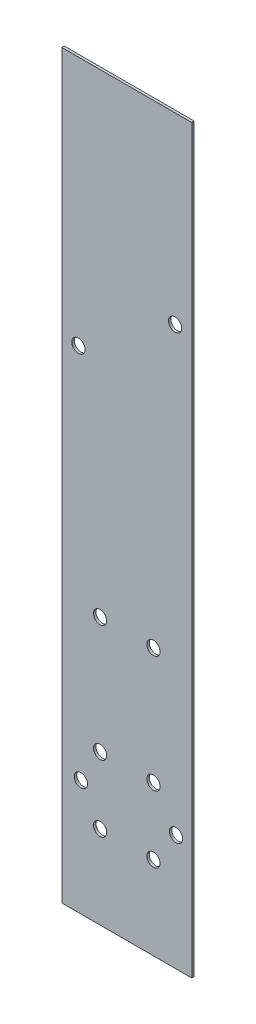
ISO-10303-21;
HEADER;
FILE_DESCRIPTION(('STEP AP214'),'2;1');
FILE_NAME('part.step','',(''),(''),'','','');
FILE_SCHEMA(('AUTOMOTIVE_DESIGN { 1 0 10303 214 1 1 1 1 }'));
ENDSEC;
DATA;
#1=APPLICATION_CONTEXT('core data for automotive mechanical design processes');
#2=APPLICATION_PROTOCOL_DEFINITION('international standard','automotive_design',2000,#1);
#3=PRODUCT_CONTEXT('',#1,'mechanical');
#4=PRODUCT('Part','Part','',(#3));
#5=PRODUCT_RELATED_PRODUCT_CATEGORY('part','',(#4));
#6=PRODUCT_DEFINITION_FORMATION('','',#4);
#7=PRODUCT_DEFINITION_CONTEXT('part definition',#1,'design');
#8=PRODUCT_DEFINITION('design','',#6,#7);
#9=PRODUCT_DEFINITION_SHAPE('','',#8);
#10=(LENGTH_UNIT() NAMED_UNIT(*) SI_UNIT(.MILLI.,.METRE.));
#11=(NAMED_UNIT(*) PLANE_ANGLE_UNIT() SI_UNIT($,.RADIAN.));
#12=(NAMED_UNIT(*) SI_UNIT($,.STERADIAN.) SOLID_ANGLE_UNIT());
#13=UNCERTAINTY_MEASURE_WITH_UNIT(LENGTH_MEASURE(1.E-05),#10,'distance_accuracy_value','');
#14=(GEOMETRIC_REPRESENTATION_CONTEXT(3) GLOBAL_UNCERTAINTY_ASSIGNED_CONTEXT((#13)) GLOBAL_UNIT_ASSIGNED_CONTEXT((#10,
#11,#12)) REPRESENTATION_CONTEXT('',''));
#15=CARTESIAN_POINT('',(0.,0.,0.));
#16=DIRECTION('',(0.,0.,1.));
#17=DIRECTION('',(1.,0.,0.));
#18=AXIS2_PLACEMENT_3D('',#15,#16,#17);
#19=CARTESIAN_POINT('',(0.,222.25,-0.736600000000004));
#20=DIRECTION('',(-1.,0.,0.));
#21=DIRECTION('',(0.,-1.,0.));
#22=AXIS2_PLACEMENT_3D('',#19,#20,#21);
#23=PLANE('',#22);
#24=DIRECTION('',(0.,-1.,0.));
#25=VECTOR('',#24,1.);
#26=CARTESIAN_POINT('',(0.,222.25,0.));
#27=LINE('',#26,#25);
#28=CARTESIAN_POINT('',(0.,222.25,0.));
#29=VERTEX_POINT('',#28);
#30=CARTESIAN_POINT('',(0.,0.,0.));
#31=VERTEX_POINT('',#30);
#32=EDGE_CURVE('E105',#29,#31,#27,.T.);
#33=ORIENTED_EDGE('',*,*,#32,.F.);
#34=DIRECTION('',(0.,0.,1.));
#35=VECTOR('',#34,1.);
#36=CARTESIAN_POINT('',(0.,222.25,-0.736600000000004));
#37=LINE('',#36,#35);
#38=CARTESIAN_POINT('',(0.,222.25,-0.736600000000004));
#39=VERTEX_POINT('',#38);
#40=EDGE_CURVE('E11',#39,#29,#37,.T.);
#41=ORIENTED_EDGE('',*,*,#40,.F.);
#42=DIRECTION('',(0.,-1.,0.));
#43=VECTOR('',#42,1.);
#44=CARTESIAN_POINT('',(0.,222.25,-0.736600000000004));
#45=LINE('',#44,#43);
#46=CARTESIAN_POINT('',(0.,0.,-0.736600000000004));
#47=VERTEX_POINT('',#46);
#48=EDGE_CURVE('E98',#39,#47,#45,.T.);
#49=ORIENTED_EDGE('',*,*,#48,.T.);
#50=DIRECTION('',(0.,0.,1.));
#51=VECTOR('',#50,1.);
#52=CARTESIAN_POINT('',(0.,0.,-0.736600000000004));
#53=LINE('',#52,#51);
#54=EDGE_CURVE('E43',#47,#31,#53,.T.);
#55=ORIENTED_EDGE('',*,*,#54,.T.);
#56=EDGE_LOOP('',(#33,#41,#49,#55));
#57=FACE_BOUND('',#56,.T.);
#58=ADVANCED_FACE('F40',(#57),#23,.T.);
#59=CARTESIAN_POINT('',(0.,222.25,-0.736600000000004));
#60=DIRECTION('',(0.,1.,0.));
#61=DIRECTION('',(0.,0.,1.));
#62=AXIS2_PLACEMENT_3D('',#59,#60,#61);
#63=PLANE('',#62);
#64=DIRECTION('',(-1.,0.,0.));
#65=VECTOR('',#64,1.);
#66=CARTESIAN_POINT('',(0.,222.25,0.));
#67=LINE('',#66,#65);
#68=CARTESIAN_POINT('',(39.,222.25,0.));
#69=VERTEX_POINT('',#68);
#70=EDGE_CURVE('E100',#69,#29,#67,.T.);
#71=ORIENTED_EDGE('',*,*,#70,.F.);
#72=DIRECTION('',(0.,0.,1.));
#73=VECTOR('',#72,1.);
#74=CARTESIAN_POINT('',(39.,222.25,-0.736600000000004));
#75=LINE('',#74,#73);
#76=CARTESIAN_POINT('',(39.,222.25,-0.736600000000004));
#77=VERTEX_POINT('',#76);
#78=EDGE_CURVE('E49',#77,#69,#75,.T.);
#79=ORIENTED_EDGE('',*,*,#78,.F.);
#80=DIRECTION('',(-1.,0.,0.));
#81=VECTOR('',#80,1.);
#82=CARTESIAN_POINT('',(0.,222.25,-0.736600000000004));
#83=LINE('',#82,#81);
#84=EDGE_CURVE('E95',#77,#39,#83,.T.);
#85=ORIENTED_EDGE('',*,*,#84,.T.);
#86=ORIENTED_EDGE('',*,*,#40,.T.);
#87=EDGE_LOOP('',(#71,#79,#85,#86));
#88=FACE_BOUND('',#87,.T.);
#89=ADVANCED_FACE('F116',(#88),#63,.T.);
#90=CARTESIAN_POINT('',(39.,222.25,-0.736600000000004));
#91=DIRECTION('',(1.,0.,0.));
#92=DIRECTION('',(0.,1.,0.));
#93=AXIS2_PLACEMENT_3D('',#90,#91,#92);
#94=PLANE('',#93);
#95=DIRECTION('',(0.,1.,0.));
#96=VECTOR('',#95,1.);
#97=CARTESIAN_POINT('',(39.,222.25,0.));
#98=LINE('',#97,#96);
#99=CARTESIAN_POINT('',(39.,0.,0.));
#100=VERTEX_POINT('',#99);
#101=EDGE_CURVE('E90',#100,#69,#98,.T.);
#102=ORIENTED_EDGE('',*,*,#101,.F.);
#103=DIRECTION('',(0.,0.,1.));
#104=VECTOR('',#103,1.);
#105=CARTESIAN_POINT('',(39.,0.,-0.736600000000004));
#106=LINE('',#105,#104);
#107=CARTESIAN_POINT('',(39.,0.,-0.736600000000004));
#108=VERTEX_POINT('',#107);
#109=EDGE_CURVE('E85',#108,#100,#106,.T.);
#110=ORIENTED_EDGE('',*,*,#109,.F.);
#111=DIRECTION('',(0.,1.,0.));
#112=VECTOR('',#111,1.);
#113=CARTESIAN_POINT('',(39.,222.25,-0.736600000000004));
#114=LINE('',#113,#112);
#115=EDGE_CURVE('E88',#108,#77,#114,.T.);
#116=ORIENTED_EDGE('',*,*,#115,.T.);
#117=ORIENTED_EDGE('',*,*,#78,.T.);
#118=EDGE_LOOP('',(#102,#110,#116,#117));
#119=FACE_BOUND('',#118,.T.);
#120=ADVANCED_FACE('F87',(#119),#94,.T.);
#121=CARTESIAN_POINT('',(0.,0.,-0.736600000000004));
#122=DIRECTION('',(0.,-1.,0.));
#123=DIRECTION('',(0.,0.,-1.));
#124=AXIS2_PLACEMENT_3D('',#121,#122,#123);
#125=PLANE('',#124);
#126=DIRECTION('',(1.,0.,0.));
#127=VECTOR('',#126,1.);
#128=CARTESIAN_POINT('',(0.,0.,0.));
#129=LINE('',#128,#127);
#130=EDGE_CURVE('E108',#31,#100,#129,.T.);
#131=ORIENTED_EDGE('',*,*,#130,.F.);
#132=ORIENTED_EDGE('',*,*,#54,.F.);
#133=DIRECTION('',(1.,0.,0.));
#134=VECTOR('',#133,1.);
#135=CARTESIAN_POINT('',(0.,0.,-0.736600000000004));
#136=LINE('',#135,#134);
#137=EDGE_CURVE('E94',#47,#108,#136,.T.);
#138=ORIENTED_EDGE('',*,*,#137,.T.);
#139=ORIENTED_EDGE('',*,*,#109,.T.);
#140=EDGE_LOOP('',(#131,#132,#138,#139));
#141=FACE_BOUND('',#140,.T.);
#142=ADVANCED_FACE('F97',(#141),#125,.T.);
#143=CARTESIAN_POINT('',(0.,0.,-0.736600000000004));
#144=DIRECTION('',(0.,0.,1.));
#145=DIRECTION('',(1.,0.,0.));
#146=AXIS2_PLACEMENT_3D('',#143,#144,#145);
#147=PLANE('',#146);
#148=CARTESIAN_POINT('',(11.5,25.,-0.736600000000004));
#149=DIRECTION('',(0.,0.,1.));
#150=DIRECTION('',(1.,0.,0.));
#151=AXIS2_PLACEMENT_3D('',#148,#149,#150);
#152=CIRCLE('',#151,1.98437500000002);
#153=CARTESIAN_POINT('',(13.484375,25.,-0.736600000000004));
#154=VERTEX_POINT('',#153);
#155=EDGE_CURVE('E184',#154,#154,#152,.T.);
#156=ORIENTED_EDGE('',*,*,#155,.T.);
#157=EDGE_LOOP('',(#156));
#158=FACE_BOUND('',#157,.T.);
#159=CARTESIAN_POINT('',(27.5,25.,-0.736600000000004));
#160=DIRECTION('',(0.,0.,1.));
#161=DIRECTION('',(1.,0.,0.));
#162=AXIS2_PLACEMENT_3D('',#159,#160,#161);
#163=CIRCLE('',#162,1.98437500000002);
#164=CARTESIAN_POINT('',(29.484375,25.,-0.736600000000004));
#165=VERTEX_POINT('',#164);
#166=EDGE_CURVE('E188',#165,#165,#163,.T.);
#167=ORIENTED_EDGE('',*,*,#166,.T.);
#168=EDGE_LOOP('',(#167));
#169=FACE_BOUND('',#168,.T.);
#170=CARTESIAN_POINT('',(34.2634,34.75,-0.736600000000004));
#171=DIRECTION('',(0.,0.,1.));
#172=DIRECTION('',(1.,0.,0.));
#173=AXIS2_PLACEMENT_3D('',#170,#171,#172);
#174=CIRCLE('',#173,1.98437500000002);
#175=CARTESIAN_POINT('',(36.247775,34.75,-0.736600000000004));
#176=VERTEX_POINT('',#175);
#177=EDGE_CURVE('E197',#176,#176,#174,.T.);
#178=ORIENTED_EDGE('',*,*,#177,.T.);
#179=EDGE_LOOP('',(#178));
#180=FACE_BOUND('',#179,.T.);
#181=CARTESIAN_POINT('',(5.73659999999999,34.75,-0.736600000000004));
#182=DIRECTION('',(0.,0.,1.));
#183=DIRECTION('',(1.,0.,0.));
#184=AXIS2_PLACEMENT_3D('',#181,#182,#183);
#185=CIRCLE('',#184,1.98437500000002);
#186=CARTESIAN_POINT('',(7.72097500000001,34.75,-0.736600000000004));
#187=VERTEX_POINT('',#186);
#188=EDGE_CURVE('E203',#187,#187,#185,.T.);
#189=ORIENTED_EDGE('',*,*,#188,.T.);
#190=EDGE_LOOP('',(#189));
#191=FACE_BOUND('',#190,.T.);
#192=CARTESIAN_POINT('',(27.5,45.,-0.736600000000004));
#193=DIRECTION('',(0.,0.,1.));
#194=DIRECTION('',(1.,0.,0.));
#195=AXIS2_PLACEMENT_3D('',#192,#193,#194);
#196=CIRCLE('',#195,1.98437500000002);
#197=CARTESIAN_POINT('',(29.484375,45.,-0.736600000000004));
#198=VERTEX_POINT('',#197);
#199=EDGE_CURVE('E209',#198,#198,#196,.T.);
#200=ORIENTED_EDGE('',*,*,#199,.T.);
#201=EDGE_LOOP('',(#200));
#202=FACE_BOUND('',#201,.T.);
#203=CARTESIAN_POINT('',(11.5,45.,-0.736600000000004));
#204=DIRECTION('',(0.,0.,1.));
#205=DIRECTION('',(1.,0.,0.));
#206=AXIS2_PLACEMENT_3D('',#203,#204,#205);
#207=CIRCLE('',#206,1.98437500000002);
#208=CARTESIAN_POINT('',(13.484375,45.,-0.736600000000004));
#209=VERTEX_POINT('',#208);
#210=EDGE_CURVE('E215',#209,#209,#207,.T.);
#211=ORIENTED_EDGE('',*,*,#210,.T.);
#212=EDGE_LOOP('',(#211));
#213=FACE_BOUND('',#212,.T.);
#214=CARTESIAN_POINT('',(11.5,80.0000000000001,-0.736600000000004));
#215=DIRECTION('',(0.,0.,1.));
#216=DIRECTION('',(1.,0.,0.));
#217=AXIS2_PLACEMENT_3D('',#214,#215,#216);
#218=CIRCLE('',#217,1.98437500000002);
#219=CARTESIAN_POINT('',(13.484375,80.0000000000001,-0.736600000000004));
#220=VERTEX_POINT('',#219);
#221=EDGE_CURVE('E221',#220,#220,#218,.T.);
#222=ORIENTED_EDGE('',*,*,#221,.T.);
#223=EDGE_LOOP('',(#222));
#224=FACE_BOUND('',#223,.T.);
#225=CARTESIAN_POINT('',(27.5,80.0000000000001,-0.736600000000004));
#226=DIRECTION('',(0.,0.,1.));
#227=DIRECTION('',(1.,0.,0.));
#228=AXIS2_PLACEMENT_3D('',#225,#226,#227);
#229=CIRCLE('',#228,1.98437500000002);
#230=CARTESIAN_POINT('',(29.484375,80.0000000000001,-0.736600000000004));
#231=VERTEX_POINT('',#230);
#232=EDGE_CURVE('E227',#231,#231,#229,.T.);
#233=ORIENTED_EDGE('',*,*,#232,.T.);
#234=EDGE_LOOP('',(#233));
#235=FACE_BOUND('',#234,.T.);
#236=CARTESIAN_POINT('',(34.,167.25,-0.736600000000004));
#237=DIRECTION('',(0.,0.,1.));
#238=DIRECTION('',(1.,0.,0.));
#239=AXIS2_PLACEMENT_3D('',#236,#237,#238);
#240=CIRCLE('',#239,1.984375);
#241=CARTESIAN_POINT('',(35.984375,167.25,-0.736600000000004));
#242=VERTEX_POINT('',#241);
#243=EDGE_CURVE('E233',#242,#242,#240,.T.);
#244=ORIENTED_EDGE('',*,*,#243,.T.);
#245=EDGE_LOOP('',(#244));
#246=FACE_BOUND('',#245,.T.);
#247=CARTESIAN_POINT('',(4.99999999999998,147.25,-0.736600000000004));
#248=DIRECTION('',(0.,0.,1.));
#249=DIRECTION('',(1.,0.,0.));
#250=AXIS2_PLACEMENT_3D('',#247,#248,#249);
#251=CIRCLE('',#250,1.98437500000001);
#252=CARTESIAN_POINT('',(6.98437499999999,147.25,-0.736600000000004));
#253=VERTEX_POINT('',#252);
#254=EDGE_CURVE('E109',#253,#253,#251,.T.);
#255=ORIENTED_EDGE('',*,*,#254,.T.);
#256=EDGE_LOOP('',(#255));
#257=FACE_BOUND('',#256,.T.);
#258=ORIENTED_EDGE('',*,*,#48,.F.);
#259=ORIENTED_EDGE('',*,*,#84,.F.);
#260=ORIENTED_EDGE('',*,*,#115,.F.);
#261=ORIENTED_EDGE('',*,*,#137,.F.);
#262=EDGE_LOOP('',(#258,#259,#260,#261));
#263=FACE_BOUND('',#262,.T.);
#264=ADVANCED_FACE('F93',(#158,#169,#180,#191,#202,#213,#224,#235,#246,#257,#263),#147,.F.);
#265=CARTESIAN_POINT('',(0.,0.,0.));
#266=DIRECTION('',(0.,0.,1.));
#267=DIRECTION('',(1.,0.,0.));
#268=AXIS2_PLACEMENT_3D('',#265,#266,#267);
#269=PLANE('',#268);
#270=CARTESIAN_POINT('',(11.5,25.,0.));
#271=DIRECTION('',(0.,0.,1.));
#272=DIRECTION('',(1.,0.,0.));
#273=AXIS2_PLACEMENT_3D('',#270,#271,#272);
#274=CIRCLE('',#273,1.98437500000002);
#275=CARTESIAN_POINT('',(13.484375,25.,0.));
#276=VERTEX_POINT('',#275);
#277=EDGE_CURVE('E182',#276,#276,#274,.T.);
#278=ORIENTED_EDGE('',*,*,#277,.F.);
#279=EDGE_LOOP('',(#278));
#280=FACE_BOUND('',#279,.T.);
#281=CARTESIAN_POINT('',(27.5,25.,0.));
#282=DIRECTION('',(0.,0.,1.));
#283=DIRECTION('',(1.,0.,0.));
#284=AXIS2_PLACEMENT_3D('',#281,#282,#283);
#285=CIRCLE('',#284,1.98437500000002);
#286=CARTESIAN_POINT('',(29.484375,25.,0.));
#287=VERTEX_POINT('',#286);
#288=EDGE_CURVE('E185',#287,#287,#285,.T.);
#289=ORIENTED_EDGE('',*,*,#288,.F.);
#290=EDGE_LOOP('',(#289));
#291=FACE_BOUND('',#290,.T.);
#292=CARTESIAN_POINT('',(34.2634,34.75,0.));
#293=DIRECTION('',(0.,0.,1.));
#294=DIRECTION('',(1.,0.,0.));
#295=AXIS2_PLACEMENT_3D('',#292,#293,#294);
#296=CIRCLE('',#295,1.98437500000002);
#297=CARTESIAN_POINT('',(36.247775,34.75,0.));
#298=VERTEX_POINT('',#297);
#299=EDGE_CURVE('E194',#298,#298,#296,.T.);
#300=ORIENTED_EDGE('',*,*,#299,.F.);
#301=EDGE_LOOP('',(#300));
#302=FACE_BOUND('',#301,.T.);
#303=CARTESIAN_POINT('',(5.73659999999999,34.75,0.));
#304=DIRECTION('',(0.,0.,1.));
#305=DIRECTION('',(1.,0.,0.));
#306=AXIS2_PLACEMENT_3D('',#303,#304,#305);
#307=CIRCLE('',#306,1.98437500000002);
#308=CARTESIAN_POINT('',(7.72097500000001,34.75,0.));
#309=VERTEX_POINT('',#308);
#310=EDGE_CURVE('E200',#309,#309,#307,.T.);
#311=ORIENTED_EDGE('',*,*,#310,.F.);
#312=EDGE_LOOP('',(#311));
#313=FACE_BOUND('',#312,.T.);
#314=CARTESIAN_POINT('',(27.5,45.,0.));
#315=DIRECTION('',(0.,0.,1.));
#316=DIRECTION('',(1.,0.,0.));
#317=AXIS2_PLACEMENT_3D('',#314,#315,#316);
#318=CIRCLE('',#317,1.98437500000002);
#319=CARTESIAN_POINT('',(29.484375,45.,0.));
#320=VERTEX_POINT('',#319);
#321=EDGE_CURVE('E206',#320,#320,#318,.T.);
#322=ORIENTED_EDGE('',*,*,#321,.F.);
#323=EDGE_LOOP('',(#322));
#324=FACE_BOUND('',#323,.T.);
#325=CARTESIAN_POINT('',(11.5,45.,0.));
#326=DIRECTION('',(0.,0.,1.));
#327=DIRECTION('',(1.,0.,0.));
#328=AXIS2_PLACEMENT_3D('',#325,#326,#327);
#329=CIRCLE('',#328,1.98437500000002);
#330=CARTESIAN_POINT('',(13.484375,45.,0.));
#331=VERTEX_POINT('',#330);
#332=EDGE_CURVE('E212',#331,#331,#329,.T.);
#333=ORIENTED_EDGE('',*,*,#332,.F.);
#334=EDGE_LOOP('',(#333));
#335=FACE_BOUND('',#334,.T.);
#336=CARTESIAN_POINT('',(11.5,80.0000000000001,0.));
#337=DIRECTION('',(0.,0.,1.));
#338=DIRECTION('',(1.,0.,0.));
#339=AXIS2_PLACEMENT_3D('',#336,#337,#338);
#340=CIRCLE('',#339,1.98437500000002);
#341=CARTESIAN_POINT('',(13.484375,80.0000000000001,0.));
#342=VERTEX_POINT('',#341);
#343=EDGE_CURVE('E218',#342,#342,#340,.T.);
#344=ORIENTED_EDGE('',*,*,#343,.F.);
#345=EDGE_LOOP('',(#344));
#346=FACE_BOUND('',#345,.T.);
#347=CARTESIAN_POINT('',(27.5,80.0000000000001,0.));
#348=DIRECTION('',(0.,0.,1.));
#349=DIRECTION('',(1.,0.,0.));
#350=AXIS2_PLACEMENT_3D('',#347,#348,#349);
#351=CIRCLE('',#350,1.98437500000002);
#352=CARTESIAN_POINT('',(29.484375,80.0000000000001,0.));
#353=VERTEX_POINT('',#352);
#354=EDGE_CURVE('E224',#353,#353,#351,.T.);
#355=ORIENTED_EDGE('',*,*,#354,.F.);
#356=EDGE_LOOP('',(#355));
#357=FACE_BOUND('',#356,.T.);
#358=CARTESIAN_POINT('',(34.,167.25,0.));
#359=DIRECTION('',(0.,0.,1.));
#360=DIRECTION('',(1.,0.,0.));
#361=AXIS2_PLACEMENT_3D('',#358,#359,#360);
#362=CIRCLE('',#361,1.984375);
#363=CARTESIAN_POINT('',(35.984375,167.25,0.));
#364=VERTEX_POINT('',#363);
#365=EDGE_CURVE('E230',#364,#364,#362,.T.);
#366=ORIENTED_EDGE('',*,*,#365,.F.);
#367=EDGE_LOOP('',(#366));
#368=FACE_BOUND('',#367,.T.);
#369=CARTESIAN_POINT('',(4.99999999999998,147.25,0.));
#370=DIRECTION('',(0.,0.,1.));
#371=DIRECTION('',(1.,0.,0.));
#372=AXIS2_PLACEMENT_3D('',#369,#370,#371);
#373=CIRCLE('',#372,1.98437500000001);
#374=CARTESIAN_POINT('',(6.98437499999999,147.25,0.));
#375=VERTEX_POINT('',#374);
#376=EDGE_CURVE('E236',#375,#375,#373,.T.);
#377=ORIENTED_EDGE('',*,*,#376,.F.);
#378=EDGE_LOOP('',(#377));
#379=FACE_BOUND('',#378,.T.);
#380=ORIENTED_EDGE('',*,*,#32,.T.);
#381=ORIENTED_EDGE('',*,*,#130,.T.);
#382=ORIENTED_EDGE('',*,*,#101,.T.);
#383=ORIENTED_EDGE('',*,*,#70,.T.);
#384=EDGE_LOOP('',(#380,#381,#382,#383));
#385=FACE_BOUND('',#384,.T.);
#386=ADVANCED_FACE('F115',(#280,#291,#302,#313,#324,#335,#346,#357,#368,#379,#385),#269,.T.);
#387=CARTESIAN_POINT('',(4.99999999999998,147.25,-10.));
#388=DIRECTION('',(0.,0.,1.));
#389=DIRECTION('',(1.,0.,0.));
#390=AXIS2_PLACEMENT_3D('',#387,#388,#389);
#391=CYLINDRICAL_SURFACE('',#390,1.98437500000001);
#392=ORIENTED_EDGE('',*,*,#376,.T.);
#393=EDGE_LOOP('',(#392));
#394=FACE_BOUND('',#393,.T.);
#395=ORIENTED_EDGE('',*,*,#254,.F.);
#396=EDGE_LOOP('',(#395));
#397=FACE_BOUND('',#396,.T.);
#398=ADVANCED_FACE('F134',(#394,#397),#391,.F.);
#399=CARTESIAN_POINT('',(34.,167.25,-10.));
#400=DIRECTION('',(0.,0.,1.));
#401=DIRECTION('',(1.,0.,0.));
#402=AXIS2_PLACEMENT_3D('',#399,#400,#401);
#403=CYLINDRICAL_SURFACE('',#402,1.984375);
#404=ORIENTED_EDGE('',*,*,#365,.T.);
#405=EDGE_LOOP('',(#404));
#406=FACE_BOUND('',#405,.T.);
#407=ORIENTED_EDGE('',*,*,#243,.F.);
#408=EDGE_LOOP('',(#407));
#409=FACE_BOUND('',#408,.T.);
#410=ADVANCED_FACE('F141',(#406,#409),#403,.F.);
#411=CARTESIAN_POINT('',(27.5,80.0000000000001,-10.));
#412=DIRECTION('',(0.,0.,1.));
#413=DIRECTION('',(1.,0.,0.));
#414=AXIS2_PLACEMENT_3D('',#411,#412,#413);
#415=CYLINDRICAL_SURFACE('',#414,1.98437500000002);
#416=ORIENTED_EDGE('',*,*,#354,.T.);
#417=EDGE_LOOP('',(#416));
#418=FACE_BOUND('',#417,.T.);
#419=ORIENTED_EDGE('',*,*,#232,.F.);
#420=EDGE_LOOP('',(#419));
#421=FACE_BOUND('',#420,.T.);
#422=ADVANCED_FACE('F145',(#418,#421),#415,.F.);
#423=CARTESIAN_POINT('',(11.5,80.0000000000001,-10.));
#424=DIRECTION('',(0.,0.,1.));
#425=DIRECTION('',(1.,0.,0.));
#426=AXIS2_PLACEMENT_3D('',#423,#424,#425);
#427=CYLINDRICAL_SURFACE('',#426,1.98437500000002);
#428=ORIENTED_EDGE('',*,*,#343,.T.);
#429=EDGE_LOOP('',(#428));
#430=FACE_BOUND('',#429,.T.);
#431=ORIENTED_EDGE('',*,*,#221,.F.);
#432=EDGE_LOOP('',(#431));
#433=FACE_BOUND('',#432,.T.);
#434=ADVANCED_FACE('F149',(#430,#433),#427,.F.);
#435=CARTESIAN_POINT('',(11.5,45.,-10.));
#436=DIRECTION('',(0.,0.,1.));
#437=DIRECTION('',(1.,0.,0.));
#438=AXIS2_PLACEMENT_3D('',#435,#436,#437);
#439=CYLINDRICAL_SURFACE('',#438,1.98437500000002);
#440=ORIENTED_EDGE('',*,*,#332,.T.);
#441=EDGE_LOOP('',(#440));
#442=FACE_BOUND('',#441,.T.);
#443=ORIENTED_EDGE('',*,*,#210,.F.);
#444=EDGE_LOOP('',(#443));
#445=FACE_BOUND('',#444,.T.);
#446=ADVANCED_FACE('F153',(#442,#445),#439,.F.);
#447=CARTESIAN_POINT('',(27.5,45.,-10.));
#448=DIRECTION('',(0.,0.,1.));
#449=DIRECTION('',(1.,0.,0.));
#450=AXIS2_PLACEMENT_3D('',#447,#448,#449);
#451=CYLINDRICAL_SURFACE('',#450,1.98437500000002);
#452=ORIENTED_EDGE('',*,*,#321,.T.);
#453=EDGE_LOOP('',(#452));
#454=FACE_BOUND('',#453,.T.);
#455=ORIENTED_EDGE('',*,*,#199,.F.);
#456=EDGE_LOOP('',(#455));
#457=FACE_BOUND('',#456,.T.);
#458=ADVANCED_FACE('F157',(#454,#457),#451,.F.);
#459=CARTESIAN_POINT('',(5.73659999999999,34.75,-10.));
#460=DIRECTION('',(0.,0.,1.));
#461=DIRECTION('',(1.,0.,0.));
#462=AXIS2_PLACEMENT_3D('',#459,#460,#461);
#463=CYLINDRICAL_SURFACE('',#462,1.98437500000002);
#464=ORIENTED_EDGE('',*,*,#310,.T.);
#465=EDGE_LOOP('',(#464));
#466=FACE_BOUND('',#465,.T.);
#467=ORIENTED_EDGE('',*,*,#188,.F.);
#468=EDGE_LOOP('',(#467));
#469=FACE_BOUND('',#468,.T.);
#470=ADVANCED_FACE('F161',(#466,#469),#463,.F.);
#471=CARTESIAN_POINT('',(34.2634,34.75,-10.));
#472=DIRECTION('',(0.,0.,1.));
#473=DIRECTION('',(1.,0.,0.));
#474=AXIS2_PLACEMENT_3D('',#471,#472,#473);
#475=CYLINDRICAL_SURFACE('',#474,1.98437500000002);
#476=ORIENTED_EDGE('',*,*,#299,.T.);
#477=EDGE_LOOP('',(#476));
#478=FACE_BOUND('',#477,.T.);
#479=ORIENTED_EDGE('',*,*,#177,.F.);
#480=EDGE_LOOP('',(#479));
#481=FACE_BOUND('',#480,.T.);
#482=ADVANCED_FACE('F165',(#478,#481),#475,.F.);
#483=CARTESIAN_POINT('',(27.5,25.,-10.));
#484=DIRECTION('',(0.,0.,1.));
#485=DIRECTION('',(1.,0.,0.));
#486=AXIS2_PLACEMENT_3D('',#483,#484,#485);
#487=CYLINDRICAL_SURFACE('',#486,1.98437500000002);
#488=ORIENTED_EDGE('',*,*,#288,.T.);
#489=EDGE_LOOP('',(#488));
#490=FACE_BOUND('',#489,.T.);
#491=ORIENTED_EDGE('',*,*,#166,.F.);
#492=EDGE_LOOP('',(#491));
#493=FACE_BOUND('',#492,.T.);
#494=ADVANCED_FACE('F169',(#490,#493),#487,.F.);
#495=CARTESIAN_POINT('',(11.5,25.,-10.));
#496=DIRECTION('',(0.,0.,1.));
#497=DIRECTION('',(1.,0.,0.));
#498=AXIS2_PLACEMENT_3D('',#495,#496,#497);
#499=CYLINDRICAL_SURFACE('',#498,1.98437500000002);
#500=ORIENTED_EDGE('',*,*,#277,.T.);
#501=EDGE_LOOP('',(#500));
#502=FACE_BOUND('',#501,.T.);
#503=ORIENTED_EDGE('',*,*,#155,.F.);
#504=EDGE_LOOP('',(#503));
#505=FACE_BOUND('',#504,.T.);
#506=ADVANCED_FACE('F173',(#502,#505),#499,.F.);
#507=CLOSED_SHELL('',(#58,#89,#120,#142,#264,#386,#398,#410,#422,#434,#446,#458,#470,#482,#494,#506));
#508=MANIFOLD_SOLID_BREP('B2',#507);
#509=ADVANCED_BREP_SHAPE_REPRESENTATION('',(#18,#508),#14);
#510=SHAPE_DEFINITION_REPRESENTATION(#9,#509);
ENDSEC;
END-ISO-10303-21;
